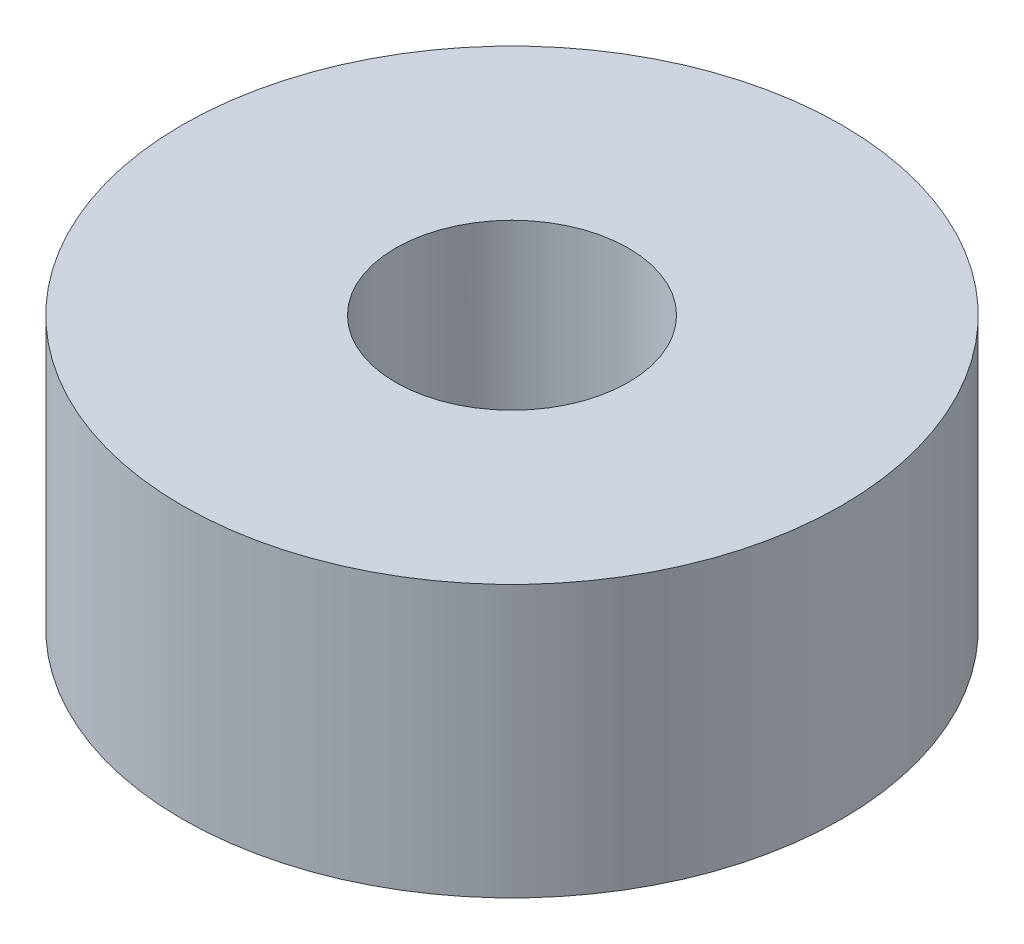
ISO-10303-21;
HEADER;
FILE_DESCRIPTION(('STEP AP214'),'2;1');
FILE_NAME('part.step','',(''),(''),'','','');
FILE_SCHEMA(('AUTOMOTIVE_DESIGN { 1 0 10303 214 1 1 1 1 }'));
ENDSEC;
DATA;
#1=APPLICATION_CONTEXT('core data for automotive mechanical design processes');
#2=APPLICATION_PROTOCOL_DEFINITION('international standard','automotive_design',2000,#1);
#3=PRODUCT_CONTEXT('',#1,'mechanical');
#4=PRODUCT('Part','Part','',(#3));
#5=PRODUCT_RELATED_PRODUCT_CATEGORY('part','',(#4));
#6=PRODUCT_DEFINITION_FORMATION('','',#4);
#7=PRODUCT_DEFINITION_CONTEXT('part definition',#1,'design');
#8=PRODUCT_DEFINITION('design','',#6,#7);
#9=PRODUCT_DEFINITION_SHAPE('','',#8);
#10=(LENGTH_UNIT() NAMED_UNIT(*) SI_UNIT(.MILLI.,.METRE.));
#11=(NAMED_UNIT(*) PLANE_ANGLE_UNIT() SI_UNIT($,.RADIAN.));
#12=(NAMED_UNIT(*) SI_UNIT($,.STERADIAN.) SOLID_ANGLE_UNIT());
#13=UNCERTAINTY_MEASURE_WITH_UNIT(LENGTH_MEASURE(1.E-05),#10,'distance_accuracy_value','');
#14=(GEOMETRIC_REPRESENTATION_CONTEXT(3) GLOBAL_UNCERTAINTY_ASSIGNED_CONTEXT((#13)) GLOBAL_UNIT_ASSIGNED_CONTEXT((#10,
#11,#12)) REPRESENTATION_CONTEXT('',''));
#15=CARTESIAN_POINT('',(0.,0.,0.));
#16=DIRECTION('',(0.,0.,1.));
#17=DIRECTION('',(1.,0.,0.));
#18=AXIS2_PLACEMENT_3D('',#15,#16,#17);
#19=CARTESIAN_POINT('',(0.,7.,0.));
#20=DIRECTION('',(0.,-1.,0.));
#21=DIRECTION('',(0.,0.,-1.));
#22=AXIS2_PLACEMENT_3D('',#19,#20,#21);
#23=CYLINDRICAL_SURFACE('',#22,8.5);
#24=CARTESIAN_POINT('',(0.,7.,0.));
#25=DIRECTION('',(0.,1.,0.));
#26=DIRECTION('',(0.,0.,1.));
#27=AXIS2_PLACEMENT_3D('',#24,#25,#26);
#28=CIRCLE('',#27,8.5);
#29=CARTESIAN_POINT('',(0.,7.,8.5));
#30=VERTEX_POINT('',#29);
#31=EDGE_CURVE('E10',#30,#30,#28,.T.);
#32=ORIENTED_EDGE('',*,*,#31,.F.);
#33=EDGE_LOOP('',(#32));
#34=FACE_BOUND('',#33,.T.);
#35=CARTESIAN_POINT('',(0.,0.,0.));
#36=DIRECTION('',(0.,1.,0.));
#37=DIRECTION('',(0.,0.,1.));
#38=AXIS2_PLACEMENT_3D('',#35,#36,#37);
#39=CIRCLE('',#38,8.5);
#40=CARTESIAN_POINT('',(0.,0.,8.5));
#41=VERTEX_POINT('',#40);
#42=EDGE_CURVE('E40',#41,#41,#39,.T.);
#43=ORIENTED_EDGE('',*,*,#42,.T.);
#44=EDGE_LOOP('',(#43));
#45=FACE_BOUND('',#44,.T.);
#46=ADVANCED_FACE('F37',(#34,#45),#23,.T.);
#47=CARTESIAN_POINT('',(0.,7.,0.));
#48=DIRECTION('',(0.,1.,0.));
#49=DIRECTION('',(0.,0.,1.));
#50=AXIS2_PLACEMENT_3D('',#47,#48,#49);
#51=PLANE('',#50);
#52=CARTESIAN_POINT('',(0.,7.,0.));
#53=DIRECTION('',(0.,1.,0.));
#54=DIRECTION('',(0.,0.,1.));
#55=AXIS2_PLACEMENT_3D('',#52,#53,#54);
#56=CIRCLE('',#55,3.);
#57=CARTESIAN_POINT('',(0.,7.,3.));
#58=VERTEX_POINT('',#57);
#59=EDGE_CURVE('E47',#58,#58,#56,.T.);
#60=ORIENTED_EDGE('',*,*,#59,.F.);
#61=EDGE_LOOP('',(#60));
#62=FACE_BOUND('',#61,.T.);
#63=ORIENTED_EDGE('',*,*,#31,.T.);
#64=EDGE_LOOP('',(#63));
#65=FACE_BOUND('',#64,.T.);
#66=ADVANCED_FACE('F60',(#62,#65),#51,.T.);
#67=CARTESIAN_POINT('',(0.,0.,0.));
#68=DIRECTION('',(0.,1.,0.));
#69=DIRECTION('',(0.,0.,1.));
#70=AXIS2_PLACEMENT_3D('',#67,#68,#69);
#71=PLANE('',#70);
#72=CARTESIAN_POINT('',(0.,0.,0.));
#73=DIRECTION('',(0.,-1.,0.));
#74=DIRECTION('',(0.,0.,-1.));
#75=AXIS2_PLACEMENT_3D('',#72,#73,#74);
#76=CIRCLE('',#75,3.);
#77=CARTESIAN_POINT('',(0.,0.,-3.));
#78=VERTEX_POINT('',#77);
#79=EDGE_CURVE('E51',#78,#78,#76,.T.);
#80=ORIENTED_EDGE('',*,*,#79,.F.);
#81=EDGE_LOOP('',(#80));
#82=FACE_BOUND('',#81,.T.);
#83=ORIENTED_EDGE('',*,*,#42,.F.);
#84=EDGE_LOOP('',(#83));
#85=FACE_BOUND('',#84,.T.);
#86=ADVANCED_FACE('F57',(#82,#85),#71,.F.);
#87=CARTESIAN_POINT('',(0.,10.,0.));
#88=DIRECTION('',(0.,-1.,0.));
#89=DIRECTION('',(0.,0.,-1.));
#90=AXIS2_PLACEMENT_3D('',#87,#88,#89);
#91=CYLINDRICAL_SURFACE('',#90,3.);
#92=ORIENTED_EDGE('',*,*,#59,.T.);
#93=EDGE_LOOP('',(#92));
#94=FACE_BOUND('',#93,.T.);
#95=ORIENTED_EDGE('',*,*,#79,.T.);
#96=EDGE_LOOP('',(#95));
#97=FACE_BOUND('',#96,.T.);
#98=ADVANCED_FACE('F55',(#94,#97),#91,.F.);
#99=CLOSED_SHELL('',(#46,#66,#86,#98));
#100=MANIFOLD_SOLID_BREP('B2',#99);
#101=ADVANCED_BREP_SHAPE_REPRESENTATION('',(#18,#100),#14);
#102=SHAPE_DEFINITION_REPRESENTATION(#9,#101);
ENDSEC;
END-ISO-10303-21;
